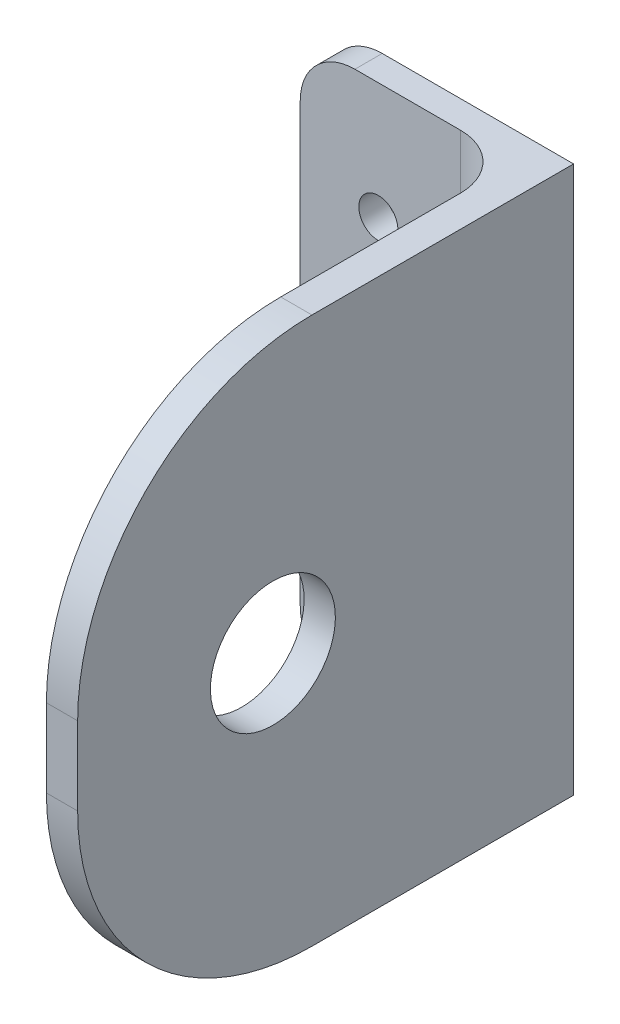
ISO-10303-21;
HEADER;
FILE_DESCRIPTION(('STEP AP214'),'2;1');
FILE_NAME('part.step','',(''),(''),'','','');
FILE_SCHEMA(('AUTOMOTIVE_DESIGN { 1 0 10303 214 1 1 1 1 }'));
ENDSEC;
DATA;
#1=APPLICATION_CONTEXT('core data for automotive mechanical design processes');
#2=APPLICATION_PROTOCOL_DEFINITION('international standard','automotive_design',2000,#1);
#3=PRODUCT_CONTEXT('',#1,'mechanical');
#4=PRODUCT('Part','Part','',(#3));
#5=PRODUCT_RELATED_PRODUCT_CATEGORY('part','',(#4));
#6=PRODUCT_DEFINITION_FORMATION('','',#4);
#7=PRODUCT_DEFINITION_CONTEXT('part definition',#1,'design');
#8=PRODUCT_DEFINITION('design','',#6,#7);
#9=PRODUCT_DEFINITION_SHAPE('','',#8);
#10=(LENGTH_UNIT() NAMED_UNIT(*) SI_UNIT(.MILLI.,.METRE.));
#11=(NAMED_UNIT(*) PLANE_ANGLE_UNIT() SI_UNIT($,.RADIAN.));
#12=(NAMED_UNIT(*) SI_UNIT($,.STERADIAN.) SOLID_ANGLE_UNIT());
#13=UNCERTAINTY_MEASURE_WITH_UNIT(LENGTH_MEASURE(1.E-05),#10,'distance_accuracy_value','');
#14=(GEOMETRIC_REPRESENTATION_CONTEXT(3) GLOBAL_UNCERTAINTY_ASSIGNED_CONTEXT((#13)) GLOBAL_UNIT_ASSIGNED_CONTEXT((#10,
#11,#12)) REPRESENTATION_CONTEXT('',''));
#15=CARTESIAN_POINT('',(0.,0.,0.));
#16=DIRECTION('',(0.,0.,1.));
#17=DIRECTION('',(1.,0.,0.));
#18=AXIS2_PLACEMENT_3D('',#15,#16,#17);
#19=CARTESIAN_POINT('',(3.27027027027028,-55.2432432432432,3.5));
#20=DIRECTION('',(0.,0.,-1.));
#21=DIRECTION('',(-1.,0.,0.));
#22=AXIS2_PLACEMENT_3D('',#19,#20,#21);
#23=CYLINDRICAL_SURFACE('',#22,7.);
#24=CARTESIAN_POINT('',(3.27027027027028,-55.2432432432432,0.));
#25=DIRECTION('',(0.,0.,1.));
#26=DIRECTION('',(1.,0.,0.));
#27=AXIS2_PLACEMENT_3D('',#24,#25,#26);
#28=CIRCLE('',#27,7.);
#29=CARTESIAN_POINT('',(-3.72972972972972,-55.2432432432432,0.));
#30=VERTEX_POINT('',#29);
#31=CARTESIAN_POINT('',(3.27027027027033,-62.2432432432432,0.));
#32=VERTEX_POINT('',#31);
#33=EDGE_CURVE('E175',#30,#32,#28,.T.);
#34=ORIENTED_EDGE('',*,*,#33,.T.);
#35=DIRECTION('',(0.,0.,-1.));
#36=VECTOR('',#35,1.);
#37=CARTESIAN_POINT('',(3.27027027027033,-62.2432432432432,3.5));
#38=LINE('',#37,#36);
#39=CARTESIAN_POINT('',(3.27027027027033,-62.2432432432432,3.5));
#40=VERTEX_POINT('',#39);
#41=EDGE_CURVE('E214',#40,#32,#38,.T.);
#42=ORIENTED_EDGE('',*,*,#41,.F.);
#43=CARTESIAN_POINT('',(3.27027027027028,-55.2432432432432,3.5));
#44=DIRECTION('',(0.,0.,1.));
#45=DIRECTION('',(1.,0.,0.));
#46=AXIS2_PLACEMENT_3D('',#43,#44,#45);
#47=CIRCLE('',#46,7.);
#48=CARTESIAN_POINT('',(-3.72972972972972,-55.2432432432432,3.5));
#49=VERTEX_POINT('',#48);
#50=EDGE_CURVE('E184',#49,#40,#47,.T.);
#51=ORIENTED_EDGE('',*,*,#50,.F.);
#52=DIRECTION('',(0.,0.,-1.));
#53=VECTOR('',#52,1.);
#54=CARTESIAN_POINT('',(-3.72972972972972,-55.2432432432432,3.5));
#55=LINE('',#54,#53);
#56=EDGE_CURVE('E196',#49,#30,#55,.T.);
#57=ORIENTED_EDGE('',*,*,#56,.T.);
#58=EDGE_LOOP('',(#34,#42,#51,#57));
#59=FACE_BOUND('',#58,.T.);
#60=ADVANCED_FACE('F33',(#59),#23,.T.);
#61=CARTESIAN_POINT('',(16.2702702702703,-62.2432432432432,3.5));
#62=DIRECTION('',(0.,1.,0.));
#63=DIRECTION('',(0.,0.,1.));
#64=AXIS2_PLACEMENT_3D('',#61,#62,#63);
#65=PLANE('',#64);
#66=DIRECTION('',(1.,0.,0.));
#67=VECTOR('',#66,1.);
#68=CARTESIAN_POINT('',(16.2702702702703,-62.2432432432432,0.));
#69=LINE('',#68,#67);
#70=CARTESIAN_POINT('',(27.7702702702703,-62.2432432432432,0.));
#71=VERTEX_POINT('',#70);
#72=EDGE_CURVE('E199',#32,#71,#69,.T.);
#73=ORIENTED_EDGE('',*,*,#72,.T.);
#74=DIRECTION('',(0.,0.,-1.));
#75=VECTOR('',#74,1.);
#76=CARTESIAN_POINT('',(27.7702702702703,-62.2432432432432,3.5));
#77=LINE('',#76,#75);
#78=CARTESIAN_POINT('',(27.7702702702703,-62.2432432432432,33.5));
#79=VERTEX_POINT('',#78);
#80=EDGE_CURVE('E163',#79,#71,#77,.T.);
#81=ORIENTED_EDGE('',*,*,#80,.F.);
#82=DIRECTION('',(1.,0.,0.));
#83=VECTOR('',#82,1.);
#84=CARTESIAN_POINT('',(23.7702702702703,-62.2432432432432,33.5));
#85=LINE('',#84,#83);
#86=CARTESIAN_POINT('',(23.7702702702703,-62.2432432432432,33.5));
#87=VERTEX_POINT('',#86);
#88=EDGE_CURVE('E126',#79,#87,#85,.F.);
#89=ORIENTED_EDGE('',*,*,#88,.T.);
#90=DIRECTION('',(0.,0.,-1.));
#91=VECTOR('',#90,1.);
#92=CARTESIAN_POINT('',(23.7702702702703,-62.2432432432432,63.5));
#93=LINE('',#92,#91);
#94=CARTESIAN_POINT('',(23.7702702702703,-62.2432432432432,10.5));
#95=VERTEX_POINT('',#94);
#96=EDGE_CURVE('E138',#87,#95,#93,.T.);
#97=ORIENTED_EDGE('',*,*,#96,.T.);
#98=CARTESIAN_POINT('',(16.7702702702703,-62.2432432432433,10.5));
#99=DIRECTION('',(0.,1.,0.));
#100=DIRECTION('',(0.,0.,1.));
#101=AXIS2_PLACEMENT_3D('',#98,#99,#100);
#102=CIRCLE('',#101,7.);
#103=CARTESIAN_POINT('',(16.7702702702703,-62.2432432432432,3.5));
#104=VERTEX_POINT('',#103);
#105=EDGE_CURVE('E41',#95,#104,#102,.T.);
#106=ORIENTED_EDGE('',*,*,#105,.T.);
#107=DIRECTION('',(1.,0.,0.));
#108=VECTOR('',#107,1.);
#109=CARTESIAN_POINT('',(3.27027027027033,-62.2432432432432,3.5));
#110=LINE('',#109,#108);
#111=EDGE_CURVE('E187',#40,#104,#110,.T.);
#112=ORIENTED_EDGE('',*,*,#111,.F.);
#113=ORIENTED_EDGE('',*,*,#41,.T.);
#114=EDGE_LOOP('',(#73,#81,#89,#97,#106,#112,#113));
#115=FACE_BOUND('',#114,.T.);
#116=ADVANCED_FACE('F223',(#115),#65,.F.);
#117=CARTESIAN_POINT('',(3.27027027027032,7.75675675675675,3.5));
#118=DIRECTION('',(0.,-1.,0.));
#119=DIRECTION('',(0.,0.,-1.));
#120=AXIS2_PLACEMENT_3D('',#117,#118,#119);
#121=PLANE('',#120);
#122=DIRECTION('',(-1.,0.,0.));
#123=VECTOR('',#122,1.);
#124=CARTESIAN_POINT('',(3.27027027027032,7.75675675675675,0.));
#125=LINE('',#124,#123);
#126=CARTESIAN_POINT('',(27.7702702702703,7.75675675675675,0.));
#127=VERTEX_POINT('',#126);
#128=CARTESIAN_POINT('',(3.27027027027032,7.75675675675675,0.));
#129=VERTEX_POINT('',#128);
#130=EDGE_CURVE('E201',#127,#129,#125,.T.);
#131=ORIENTED_EDGE('',*,*,#130,.T.);
#132=DIRECTION('',(0.,0.,-1.));
#133=VECTOR('',#132,1.);
#134=CARTESIAN_POINT('',(3.27027027027032,7.75675675675675,3.5));
#135=LINE('',#134,#133);
#136=CARTESIAN_POINT('',(3.27027027027032,7.75675675675675,3.5));
#137=VERTEX_POINT('',#136);
#138=EDGE_CURVE('E211',#137,#129,#135,.T.);
#139=ORIENTED_EDGE('',*,*,#138,.F.);
#140=DIRECTION('',(-1.,0.,0.));
#141=VECTOR('',#140,1.);
#142=CARTESIAN_POINT('',(9.27027027027022,7.75675675675675,3.5));
#143=LINE('',#142,#141);
#144=CARTESIAN_POINT('',(16.7702702702703,7.75675675675675,3.5));
#145=VERTEX_POINT('',#144);
#146=EDGE_CURVE('E190',#145,#137,#143,.T.);
#147=ORIENTED_EDGE('',*,*,#146,.F.);
#148=CARTESIAN_POINT('',(16.7702702702703,7.75675675675675,10.5));
#149=DIRECTION('',(0.,-1.,0.));
#150=DIRECTION('',(0.,0.,-1.));
#151=AXIS2_PLACEMENT_3D('',#148,#149,#150);
#152=CIRCLE('',#151,7.);
#153=CARTESIAN_POINT('',(23.7702702702703,7.75675675675675,10.5));
#154=VERTEX_POINT('',#153);
#155=EDGE_CURVE('E11',#145,#154,#152,.T.);
#156=ORIENTED_EDGE('',*,*,#155,.T.);
#157=DIRECTION('',(0.,0.,-1.));
#158=VECTOR('',#157,1.);
#159=CARTESIAN_POINT('',(23.7702702702703,7.75675675675675,63.5));
#160=LINE('',#159,#158);
#161=CARTESIAN_POINT('',(23.7702702702703,7.75675675675675,33.5));
#162=VERTEX_POINT('',#161);
#163=EDGE_CURVE('E145',#162,#154,#160,.T.);
#164=ORIENTED_EDGE('',*,*,#163,.F.);
#165=DIRECTION('',(-1.,0.,0.));
#166=VECTOR('',#165,1.);
#167=CARTESIAN_POINT('',(27.7702702702703,7.75675675675675,33.5));
#168=LINE('',#167,#166);
#169=CARTESIAN_POINT('',(27.7702702702703,7.75675675675675,33.5));
#170=VERTEX_POINT('',#169);
#171=EDGE_CURVE('E120',#162,#170,#168,.F.);
#172=ORIENTED_EDGE('',*,*,#171,.T.);
#173=DIRECTION('',(0.,0.,1.));
#174=VECTOR('',#173,1.);
#175=CARTESIAN_POINT('',(27.7702702702703,7.75675675675675,3.5));
#176=LINE('',#175,#174);
#177=EDGE_CURVE('E169',#127,#170,#176,.T.);
#178=ORIENTED_EDGE('',*,*,#177,.F.);
#179=EDGE_LOOP('',(#131,#139,#147,#156,#164,#172,#178));
#180=FACE_BOUND('',#179,.T.);
#181=ADVANCED_FACE('F233',(#180),#121,.F.);
#182=CARTESIAN_POINT('',(3.27027027027027,0.756756756756755,3.5));
#183=DIRECTION('',(0.,0.,-1.));
#184=DIRECTION('',(-1.,0.,0.));
#185=AXIS2_PLACEMENT_3D('',#182,#183,#184);
#186=CYLINDRICAL_SURFACE('',#185,7.);
#187=CARTESIAN_POINT('',(3.27027027027027,0.756756756756755,0.));
#188=DIRECTION('',(0.,0.,1.));
#189=DIRECTION('',(1.,0.,0.));
#190=AXIS2_PLACEMENT_3D('',#187,#188,#189);
#191=CIRCLE('',#190,7.);
#192=CARTESIAN_POINT('',(-3.72972972972973,0.756756756756705,0.));
#193=VERTEX_POINT('',#192);
#194=EDGE_CURVE('E203',#129,#193,#191,.T.);
#195=ORIENTED_EDGE('',*,*,#194,.T.);
#196=DIRECTION('',(0.,0.,-1.));
#197=VECTOR('',#196,1.);
#198=CARTESIAN_POINT('',(-3.72972972972973,0.756756756756705,3.5));
#199=LINE('',#198,#197);
#200=CARTESIAN_POINT('',(-3.72972972972973,0.756756756756705,3.5));
#201=VERTEX_POINT('',#200);
#202=EDGE_CURVE('E208',#201,#193,#199,.T.);
#203=ORIENTED_EDGE('',*,*,#202,.F.);
#204=CARTESIAN_POINT('',(3.27027027027027,0.756756756756755,3.5));
#205=DIRECTION('',(0.,0.,1.));
#206=DIRECTION('',(1.,0.,0.));
#207=AXIS2_PLACEMENT_3D('',#204,#205,#206);
#208=CIRCLE('',#207,7.);
#209=EDGE_CURVE('E192',#137,#201,#208,.T.);
#210=ORIENTED_EDGE('',*,*,#209,.F.);
#211=ORIENTED_EDGE('',*,*,#138,.T.);
#212=EDGE_LOOP('',(#195,#203,#210,#211));
#213=FACE_BOUND('',#212,.T.);
#214=ADVANCED_FACE('F249',(#213),#186,.T.);
#215=CARTESIAN_POINT('',(-3.72972972972973,0.756756756756705,3.5));
#216=DIRECTION('',(1.,0.,0.));
#217=DIRECTION('',(0.,1.,0.));
#218=AXIS2_PLACEMENT_3D('',#215,#216,#217);
#219=PLANE('',#218);
#220=DIRECTION('',(0.,-1.,0.));
#221=VECTOR('',#220,1.);
#222=CARTESIAN_POINT('',(-3.72972972972973,0.756756756756705,0.));
#223=LINE('',#222,#221);
#224=EDGE_CURVE('E188',#193,#30,#223,.T.);
#225=ORIENTED_EDGE('',*,*,#224,.T.);
#226=ORIENTED_EDGE('',*,*,#56,.F.);
#227=DIRECTION('',(0.,-1.,0.));
#228=VECTOR('',#227,1.);
#229=CARTESIAN_POINT('',(-3.72972972972973,0.756756756756705,3.5));
#230=LINE('',#229,#228);
#231=EDGE_CURVE('E194',#201,#49,#230,.T.);
#232=ORIENTED_EDGE('',*,*,#231,.F.);
#233=ORIENTED_EDGE('',*,*,#202,.T.);
#234=EDGE_LOOP('',(#225,#226,#232,#233));
#235=FACE_BOUND('',#234,.T.);
#236=ADVANCED_FACE('F252',(#235),#219,.F.);
#237=CARTESIAN_POINT('',(3.27027027027028,-55.2432432432432,3.5));
#238=DIRECTION('',(0.,0.,1.));
#239=DIRECTION('',(1.,0.,0.));
#240=AXIS2_PLACEMENT_3D('',#237,#238,#239);
#241=PLANE('',#240);
#242=ORIENTED_EDGE('',*,*,#111,.T.);
#243=DIRECTION('',(0.,-1.,0.));
#244=VECTOR('',#243,1.);
#245=CARTESIAN_POINT('',(16.7702702702703,-55.2432432432432,3.5));
#246=LINE('',#245,#244);
#247=EDGE_CURVE('E54',#104,#145,#246,.F.);
#248=ORIENTED_EDGE('',*,*,#247,.T.);
#249=ORIENTED_EDGE('',*,*,#146,.T.);
#250=ORIENTED_EDGE('',*,*,#209,.T.);
#251=ORIENTED_EDGE('',*,*,#231,.T.);
#252=ORIENTED_EDGE('',*,*,#50,.T.);
#253=EDGE_LOOP('',(#242,#248,#249,#250,#251,#252));
#254=FACE_BOUND('',#253,.T.);
#255=CARTESIAN_POINT('',(6.27027027027028,-7.24324324324324,3.5));
#256=DIRECTION('',(0.,0.,1.));
#257=DIRECTION('',(1.,0.,0.));
#258=AXIS2_PLACEMENT_3D('',#255,#256,#257);
#259=CIRCLE('',#258,2.5);
#260=CARTESIAN_POINT('',(8.77027027027028,-7.24324324324324,3.5));
#261=VERTEX_POINT('',#260);
#262=EDGE_CURVE('E176',#261,#261,#259,.T.);
#263=ORIENTED_EDGE('',*,*,#262,.F.);
#264=EDGE_LOOP('',(#263));
#265=FACE_BOUND('',#264,.T.);
#266=CARTESIAN_POINT('',(6.27027027027027,-47.2432432432432,3.5));
#267=DIRECTION('',(0.,0.,1.));
#268=DIRECTION('',(1.,0.,0.));
#269=AXIS2_PLACEMENT_3D('',#266,#267,#268);
#270=CIRCLE('',#269,2.5);
#271=CARTESIAN_POINT('',(8.77027027027027,-47.2432432432432,3.5));
#272=VERTEX_POINT('',#271);
#273=EDGE_CURVE('E171',#272,#272,#270,.T.);
#274=ORIENTED_EDGE('',*,*,#273,.F.);
#275=EDGE_LOOP('',(#274));
#276=FACE_BOUND('',#275,.T.);
#277=ADVANCED_FACE('F256',(#254,#265,#276),#241,.T.);
#278=CARTESIAN_POINT('',(3.27027027027028,-55.2432432432432,0.));
#279=DIRECTION('',(0.,0.,1.));
#280=DIRECTION('',(1.,0.,0.));
#281=AXIS2_PLACEMENT_3D('',#278,#279,#280);
#282=PLANE('',#281);
#283=CARTESIAN_POINT('',(6.27027027027028,-7.24324324324324,0.));
#284=DIRECTION('',(0.,0.,1.));
#285=DIRECTION('',(1.,0.,0.));
#286=AXIS2_PLACEMENT_3D('',#283,#284,#285);
#287=CIRCLE('',#286,2.5);
#288=CARTESIAN_POINT('',(8.77027027027028,-7.24324324324324,0.));
#289=VERTEX_POINT('',#288);
#290=EDGE_CURVE('E172',#289,#289,#287,.T.);
#291=ORIENTED_EDGE('',*,*,#290,.T.);
#292=EDGE_LOOP('',(#291));
#293=FACE_BOUND('',#292,.T.);
#294=CARTESIAN_POINT('',(6.27027027027027,-47.2432432432432,0.));
#295=DIRECTION('',(0.,0.,1.));
#296=DIRECTION('',(1.,0.,0.));
#297=AXIS2_PLACEMENT_3D('',#294,#295,#296);
#298=CIRCLE('',#297,2.5);
#299=CARTESIAN_POINT('',(8.77027027027027,-47.2432432432432,0.));
#300=VERTEX_POINT('',#299);
#301=EDGE_CURVE('E179',#300,#300,#298,.T.);
#302=ORIENTED_EDGE('',*,*,#301,.T.);
#303=EDGE_LOOP('',(#302));
#304=FACE_BOUND('',#303,.T.);
#305=ORIENTED_EDGE('',*,*,#33,.F.);
#306=ORIENTED_EDGE('',*,*,#224,.F.);
#307=ORIENTED_EDGE('',*,*,#194,.F.);
#308=ORIENTED_EDGE('',*,*,#130,.F.);
#309=DIRECTION('',(0.,1.,0.));
#310=VECTOR('',#309,1.);
#311=CARTESIAN_POINT('',(27.7702702702703,7.75675675675675,0.));
#312=LINE('',#311,#310);
#313=EDGE_CURVE('E166',#71,#127,#312,.T.);
#314=ORIENTED_EDGE('',*,*,#313,.F.);
#315=ORIENTED_EDGE('',*,*,#72,.F.);
#316=EDGE_LOOP('',(#305,#306,#307,#308,#314,#315));
#317=FACE_BOUND('',#316,.T.);
#318=ADVANCED_FACE('F258',(#293,#304,#317),#282,.F.);
#319=CARTESIAN_POINT('',(6.27027027027027,-47.2432432432432,0.));
#320=DIRECTION('',(0.,0.,1.));
#321=DIRECTION('',(1.,0.,0.));
#322=AXIS2_PLACEMENT_3D('',#319,#320,#321);
#323=CYLINDRICAL_SURFACE('',#322,2.5);
#324=ORIENTED_EDGE('',*,*,#301,.F.);
#325=EDGE_LOOP('',(#324));
#326=FACE_BOUND('',#325,.T.);
#327=ORIENTED_EDGE('',*,*,#273,.T.);
#328=EDGE_LOOP('',(#327));
#329=FACE_BOUND('',#328,.T.);
#330=ADVANCED_FACE('F261',(#326,#329),#323,.F.);
#331=CARTESIAN_POINT('',(6.27027027027028,-7.24324324324324,0.));
#332=DIRECTION('',(0.,0.,1.));
#333=DIRECTION('',(1.,0.,0.));
#334=AXIS2_PLACEMENT_3D('',#331,#332,#333);
#335=CYLINDRICAL_SURFACE('',#334,2.5);
#336=ORIENTED_EDGE('',*,*,#290,.F.);
#337=EDGE_LOOP('',(#336));
#338=FACE_BOUND('',#337,.T.);
#339=ORIENTED_EDGE('',*,*,#262,.T.);
#340=EDGE_LOOP('',(#339));
#341=FACE_BOUND('',#340,.T.);
#342=ADVANCED_FACE('F267',(#338,#341),#335,.F.);
#343=CARTESIAN_POINT('',(27.7702702702703,0.,0.));
#344=DIRECTION('',(1.,0.,0.));
#345=DIRECTION('',(0.,0.,-1.));
#346=AXIS2_PLACEMENT_3D('',#343,#344,#345);
#347=PLANE('',#346);
#348=ORIENTED_EDGE('',*,*,#177,.T.);
#349=CARTESIAN_POINT('',(27.7702702702703,-22.2432432432432,33.5));
#350=DIRECTION('',(-1.,0.,0.));
#351=DIRECTION('',(0.,-1.,0.));
#352=AXIS2_PLACEMENT_3D('',#349,#350,#351);
#353=CIRCLE('',#352,30.);
#354=CARTESIAN_POINT('',(27.7702702702703,-22.2432432432432,63.5));
#355=VERTEX_POINT('',#354);
#356=EDGE_CURVE('E155',#170,#355,#353,.F.);
#357=ORIENTED_EDGE('',*,*,#356,.T.);
#358=DIRECTION('',(0.,1.,0.));
#359=VECTOR('',#358,1.);
#360=CARTESIAN_POINT('',(27.7702702702703,7.75675675675675,63.5));
#361=LINE('',#360,#359);
#362=CARTESIAN_POINT('',(27.7702702702703,-32.2432432432432,63.5));
#363=VERTEX_POINT('',#362);
#364=EDGE_CURVE('E136',#363,#355,#361,.T.);
#365=ORIENTED_EDGE('',*,*,#364,.F.);
#366=CARTESIAN_POINT('',(27.7702702702703,-32.2432432432432,33.5));
#367=DIRECTION('',(-1.,0.,0.));
#368=DIRECTION('',(0.,-1.,0.));
#369=AXIS2_PLACEMENT_3D('',#366,#367,#368);
#370=CIRCLE('',#369,30.);
#371=EDGE_CURVE('E157',#363,#79,#370,.F.);
#372=ORIENTED_EDGE('',*,*,#371,.T.);
#373=ORIENTED_EDGE('',*,*,#80,.T.);
#374=ORIENTED_EDGE('',*,*,#313,.T.);
#375=EDGE_LOOP('',(#348,#357,#365,#372,#373,#374));
#376=FACE_BOUND('',#375,.T.);
#377=CARTESIAN_POINT('',(27.7702702702703,-27.2432432432433,38.5));
#378=DIRECTION('',(1.,0.,0.));
#379=DIRECTION('',(0.,1.,0.));
#380=AXIS2_PLACEMENT_3D('',#377,#378,#379);
#381=CIRCLE('',#380,8.);
#382=CARTESIAN_POINT('',(27.7702702702703,-19.2432432432433,38.5));
#383=VERTEX_POINT('',#382);
#384=EDGE_CURVE('E148',#383,#383,#381,.T.);
#385=ORIENTED_EDGE('',*,*,#384,.F.);
#386=EDGE_LOOP('',(#385));
#387=FACE_BOUND('',#386,.T.);
#388=ADVANCED_FACE('F228',(#376,#387),#347,.T.);
#389=CARTESIAN_POINT('',(23.7702702702703,7.75675675675675,63.5));
#390=DIRECTION('',(1.,0.,0.));
#391=DIRECTION('',(0.,1.,0.));
#392=AXIS2_PLACEMENT_3D('',#389,#390,#391);
#393=PLANE('',#392);
#394=CARTESIAN_POINT('',(23.7702702702703,-27.2432432432433,38.5));
#395=DIRECTION('',(1.,0.,0.));
#396=DIRECTION('',(0.,1.,0.));
#397=AXIS2_PLACEMENT_3D('',#394,#395,#396);
#398=CIRCLE('',#397,8.);
#399=CARTESIAN_POINT('',(23.7702702702703,-19.2432432432433,38.5));
#400=VERTEX_POINT('',#399);
#401=EDGE_CURVE('E143',#400,#400,#398,.T.);
#402=ORIENTED_EDGE('',*,*,#401,.T.);
#403=EDGE_LOOP('',(#402));
#404=FACE_BOUND('',#403,.T.);
#405=ORIENTED_EDGE('',*,*,#163,.T.);
#406=DIRECTION('',(0.,-1.,0.));
#407=VECTOR('',#406,1.);
#408=CARTESIAN_POINT('',(23.7702702702703,7.75675675675675,10.5));
#409=LINE('',#408,#407);
#410=EDGE_CURVE('E217',#154,#95,#409,.T.);
#411=ORIENTED_EDGE('',*,*,#410,.T.);
#412=ORIENTED_EDGE('',*,*,#96,.F.);
#413=CARTESIAN_POINT('',(23.7702702702703,-32.2432432432432,33.5));
#414=DIRECTION('',(1.,0.,0.));
#415=DIRECTION('',(0.,1.,0.));
#416=AXIS2_PLACEMENT_3D('',#413,#414,#415);
#417=CIRCLE('',#416,30.);
#418=CARTESIAN_POINT('',(23.7702702702703,-32.2432432432432,63.5));
#419=VERTEX_POINT('',#418);
#420=EDGE_CURVE('E125',#87,#419,#417,.F.);
#421=ORIENTED_EDGE('',*,*,#420,.T.);
#422=DIRECTION('',(0.,-1.,0.));
#423=VECTOR('',#422,1.);
#424=CARTESIAN_POINT('',(23.7702702702703,7.75675675675675,63.5));
#425=LINE('',#424,#423);
#426=CARTESIAN_POINT('',(23.7702702702703,-22.2432432432432,63.5));
#427=VERTEX_POINT('',#426);
#428=EDGE_CURVE('E133',#427,#419,#425,.T.);
#429=ORIENTED_EDGE('',*,*,#428,.F.);
#430=CARTESIAN_POINT('',(23.7702702702703,-22.2432432432432,33.5));
#431=DIRECTION('',(1.,0.,0.));
#432=DIRECTION('',(0.,1.,0.));
#433=AXIS2_PLACEMENT_3D('',#430,#431,#432);
#434=CIRCLE('',#433,30.);
#435=EDGE_CURVE('E114',#427,#162,#434,.F.);
#436=ORIENTED_EDGE('',*,*,#435,.T.);
#437=EDGE_LOOP('',(#405,#411,#412,#421,#429,#436));
#438=FACE_BOUND('',#437,.T.);
#439=ADVANCED_FACE('F140',(#404,#438),#393,.F.);
#440=CARTESIAN_POINT('',(0.,0.,63.5));
#441=DIRECTION('',(0.,0.,1.));
#442=DIRECTION('',(1.,0.,0.));
#443=AXIS2_PLACEMENT_3D('',#440,#441,#442);
#444=PLANE('',#443);
#445=ORIENTED_EDGE('',*,*,#428,.T.);
#446=DIRECTION('',(1.,0.,0.));
#447=VECTOR('',#446,1.);
#448=CARTESIAN_POINT('',(27.7702702702703,-32.2432432432432,63.5));
#449=LINE('',#448,#447);
#450=EDGE_CURVE('E137',#419,#363,#449,.T.);
#451=ORIENTED_EDGE('',*,*,#450,.T.);
#452=ORIENTED_EDGE('',*,*,#364,.T.);
#453=DIRECTION('',(-1.,0.,0.));
#454=VECTOR('',#453,1.);
#455=CARTESIAN_POINT('',(23.7702702702703,-22.2432432432432,63.5));
#456=LINE('',#455,#454);
#457=EDGE_CURVE('E118',#355,#427,#456,.T.);
#458=ORIENTED_EDGE('',*,*,#457,.T.);
#459=EDGE_LOOP('',(#445,#451,#452,#458));
#460=FACE_BOUND('',#459,.T.);
#461=ADVANCED_FACE('F131',(#460),#444,.T.);
#462=CARTESIAN_POINT('',(21.7702702702703,-27.2432432432433,38.5));
#463=DIRECTION('',(1.,0.,0.));
#464=DIRECTION('',(0.,1.,0.));
#465=AXIS2_PLACEMENT_3D('',#462,#463,#464);
#466=CYLINDRICAL_SURFACE('',#465,8.);
#467=ORIENTED_EDGE('',*,*,#384,.T.);
#468=EDGE_LOOP('',(#467));
#469=FACE_BOUND('',#468,.T.);
#470=ORIENTED_EDGE('',*,*,#401,.F.);
#471=EDGE_LOOP('',(#470));
#472=FACE_BOUND('',#471,.T.);
#473=ADVANCED_FACE('F276',(#469,#472),#466,.F.);
#474=CARTESIAN_POINT('',(0.,-32.2432432432432,33.5));
#475=DIRECTION('',(-1.,0.,0.));
#476=DIRECTION('',(0.,0.,1.));
#477=AXIS2_PLACEMENT_3D('',#474,#475,#476);
#478=CYLINDRICAL_SURFACE('',#477,30.);
#479=ORIENTED_EDGE('',*,*,#420,.F.);
#480=ORIENTED_EDGE('',*,*,#88,.F.);
#481=ORIENTED_EDGE('',*,*,#371,.F.);
#482=ORIENTED_EDGE('',*,*,#450,.F.);
#483=EDGE_LOOP('',(#479,#480,#481,#482));
#484=FACE_BOUND('',#483,.T.);
#485=ADVANCED_FACE('F226',(#484),#478,.T.);
#486=CARTESIAN_POINT('',(0.,-22.2432432432432,33.5));
#487=DIRECTION('',(1.,0.,0.));
#488=DIRECTION('',(0.,1.,0.));
#489=AXIS2_PLACEMENT_3D('',#486,#487,#488);
#490=CYLINDRICAL_SURFACE('',#489,30.);
#491=ORIENTED_EDGE('',*,*,#356,.F.);
#492=ORIENTED_EDGE('',*,*,#171,.F.);
#493=ORIENTED_EDGE('',*,*,#435,.F.);
#494=ORIENTED_EDGE('',*,*,#457,.F.);
#495=EDGE_LOOP('',(#491,#492,#493,#494));
#496=FACE_BOUND('',#495,.T.);
#497=ADVANCED_FACE('F117',(#496),#490,.T.);
#498=CARTESIAN_POINT('',(16.7702702702703,7.75675675675675,10.5));
#499=DIRECTION('',(0.,-1.,0.));
#500=DIRECTION('',(1.,0.,0.));
#501=AXIS2_PLACEMENT_3D('',#498,#499,#500);
#502=CYLINDRICAL_SURFACE('',#501,7.);
#503=ORIENTED_EDGE('',*,*,#155,.F.);
#504=ORIENTED_EDGE('',*,*,#247,.F.);
#505=ORIENTED_EDGE('',*,*,#105,.F.);
#506=ORIENTED_EDGE('',*,*,#410,.F.);
#507=EDGE_LOOP('',(#503,#504,#505,#506));
#508=FACE_BOUND('',#507,.T.);
#509=ADVANCED_FACE('F35',(#508),#502,.F.);
#510=CLOSED_SHELL('',(#60,#116,#181,#214,#236,#277,#318,#330,#342,#388,#439,#461,#473,#485,#497,#509));
#511=MANIFOLD_SOLID_BREP('B2',#510);
#512=ADVANCED_BREP_SHAPE_REPRESENTATION('',(#18,#511),#14);
#513=SHAPE_DEFINITION_REPRESENTATION(#9,#512);
ENDSEC;
END-ISO-10303-21;
